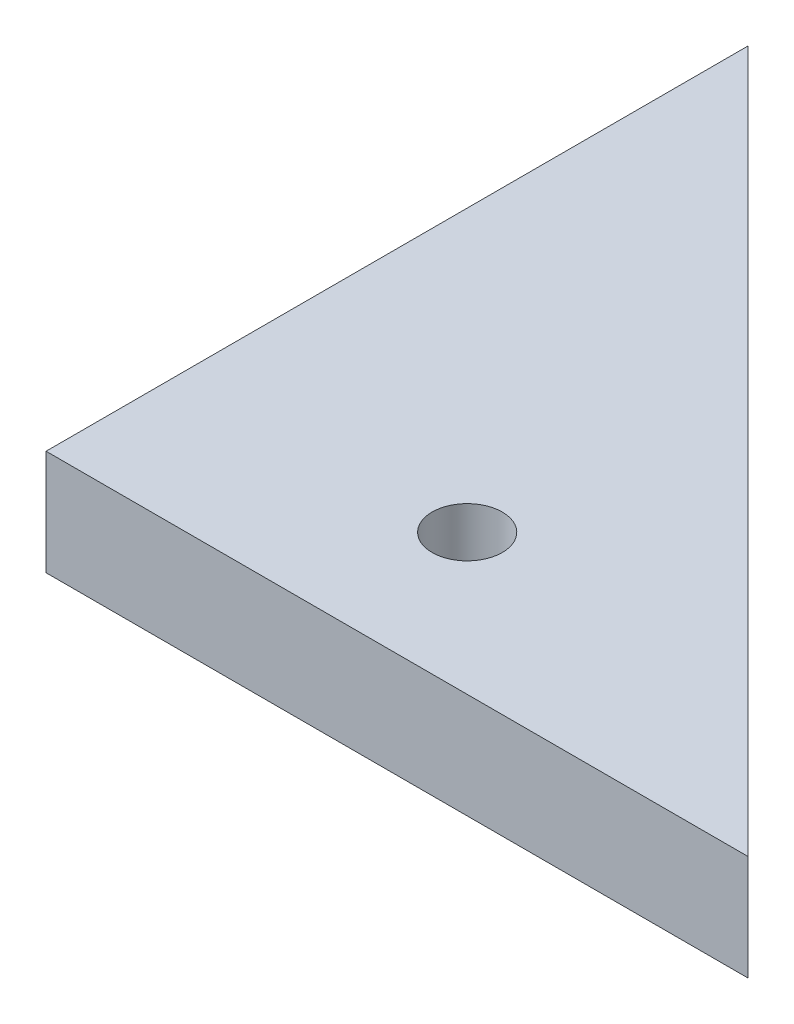
ISO-10303-21;
HEADER;
FILE_DESCRIPTION(('STEP AP214'),'2;1');
FILE_NAME('part.step','',(''),(''),'','','');
FILE_SCHEMA(('AUTOMOTIVE_DESIGN { 1 0 10303 214 1 1 1 1 }'));
ENDSEC;
DATA;
#1=APPLICATION_CONTEXT('core data for automotive mechanical design processes');
#2=APPLICATION_PROTOCOL_DEFINITION('international standard','automotive_design',2000,#1);
#3=PRODUCT_CONTEXT('',#1,'mechanical');
#4=PRODUCT('Part','Part','',(#3));
#5=PRODUCT_RELATED_PRODUCT_CATEGORY('part','',(#4));
#6=PRODUCT_DEFINITION_FORMATION('','',#4);
#7=PRODUCT_DEFINITION_CONTEXT('part definition',#1,'design');
#8=PRODUCT_DEFINITION('design','',#6,#7);
#9=PRODUCT_DEFINITION_SHAPE('','',#8);
#10=(LENGTH_UNIT() NAMED_UNIT(*) SI_UNIT(.MILLI.,.METRE.));
#11=(NAMED_UNIT(*) PLANE_ANGLE_UNIT() SI_UNIT($,.RADIAN.));
#12=(NAMED_UNIT(*) SI_UNIT($,.STERADIAN.) SOLID_ANGLE_UNIT());
#13=UNCERTAINTY_MEASURE_WITH_UNIT(LENGTH_MEASURE(1.E-05),#10,'distance_accuracy_value','');
#14=(GEOMETRIC_REPRESENTATION_CONTEXT(3) GLOBAL_UNCERTAINTY_ASSIGNED_CONTEXT((#13)) GLOBAL_UNIT_ASSIGNED_CONTEXT((#10,
#11,#12)) REPRESENTATION_CONTEXT('',''));
#15=CARTESIAN_POINT('',(0.,0.,0.));
#16=DIRECTION('',(0.,0.,1.));
#17=DIRECTION('',(1.,0.,0.));
#18=AXIS2_PLACEMENT_3D('',#15,#16,#17);
#19=CARTESIAN_POINT('',(0.,19.05,0.));
#20=DIRECTION('',(0.,1.,0.));
#21=DIRECTION('',(0.,0.,1.));
#22=AXIS2_PLACEMENT_3D('',#19,#20,#21);
#23=PLANE('',#22);
#24=DIRECTION('',(1.,0.,0.));
#25=VECTOR('',#24,1.);
#26=CARTESIAN_POINT('',(-14.358347107438,19.05,0.));
#27=LINE('',#26,#25);
#28=CARTESIAN_POINT('',(-14.358347107438,19.05,0.));
#29=VERTEX_POINT('',#28);
#30=CARTESIAN_POINT('',(112.641652892562,19.05,0.));
#31=VERTEX_POINT('',#30);
#32=EDGE_CURVE('E74',#29,#31,#27,.T.);
#33=ORIENTED_EDGE('',*,*,#32,.T.);
#34=DIRECTION('',(-0.707106781186548,0.,-0.707106781186548));
#35=VECTOR('',#34,1.);
#36=CARTESIAN_POINT('',(-14.358347107438,19.05,-127.));
#37=LINE('',#36,#35);
#38=CARTESIAN_POINT('',(-14.358347107438,19.05,-127.));
#39=VERTEX_POINT('',#38);
#40=EDGE_CURVE('E70',#31,#39,#37,.T.);
#41=ORIENTED_EDGE('',*,*,#40,.T.);
#42=DIRECTION('',(0.,0.,1.));
#43=VECTOR('',#42,1.);
#44=CARTESIAN_POINT('',(-14.358347107438,19.05,0.));
#45=LINE('',#44,#43);
#46=EDGE_CURVE('E50',#39,#29,#45,.T.);
#47=ORIENTED_EDGE('',*,*,#46,.T.);
#48=EDGE_LOOP('',(#33,#41,#47));
#49=FACE_BOUND('',#48,.T.);
#50=CARTESIAN_POINT('',(36.441652892562,19.05,-25.4));
#51=DIRECTION('',(0.,1.,0.));
#52=DIRECTION('',(0.,0.,1.));
#53=AXIS2_PLACEMENT_3D('',#50,#51,#52);
#54=CIRCLE('',#53,6.35);
#55=CARTESIAN_POINT('',(36.441652892562,19.05,-31.75));
#56=VERTEX_POINT('',#55);
#57=EDGE_CURVE('E84',#56,#56,#54,.T.);
#58=ORIENTED_EDGE('',*,*,#57,.F.);
#59=EDGE_LOOP('',(#58));
#60=FACE_BOUND('',#59,.T.);
#61=ADVANCED_FACE('F33',(#49,#60),#23,.T.);
#62=CARTESIAN_POINT('',(0.,0.,0.));
#63=DIRECTION('',(0.,1.,0.));
#64=DIRECTION('',(0.,0.,1.));
#65=AXIS2_PLACEMENT_3D('',#62,#63,#64);
#66=PLANE('',#65);
#67=DIRECTION('',(1.,0.,0.));
#68=VECTOR('',#67,1.);
#69=CARTESIAN_POINT('',(-14.358347107438,0.,0.));
#70=LINE('',#69,#68);
#71=CARTESIAN_POINT('',(-14.358347107438,0.,0.));
#72=VERTEX_POINT('',#71);
#73=CARTESIAN_POINT('',(112.641652892562,0.,0.));
#74=VERTEX_POINT('',#73);
#75=EDGE_CURVE('E81',#72,#74,#70,.T.);
#76=ORIENTED_EDGE('',*,*,#75,.F.);
#77=DIRECTION('',(0.,0.,1.));
#78=VECTOR('',#77,1.);
#79=CARTESIAN_POINT('',(-14.358347107438,0.,0.));
#80=LINE('',#79,#78);
#81=CARTESIAN_POINT('',(-14.358347107438,0.,-127.));
#82=VERTEX_POINT('',#81);
#83=EDGE_CURVE('E67',#82,#72,#80,.T.);
#84=ORIENTED_EDGE('',*,*,#83,.F.);
#85=DIRECTION('',(-0.707106781186548,0.,-0.707106781186548));
#86=VECTOR('',#85,1.);
#87=CARTESIAN_POINT('',(-14.358347107438,0.,-127.));
#88=LINE('',#87,#86);
#89=EDGE_CURVE('E62',#74,#82,#88,.T.);
#90=ORIENTED_EDGE('',*,*,#89,.F.);
#91=EDGE_LOOP('',(#76,#84,#90));
#92=FACE_BOUND('',#91,.T.);
#93=CARTESIAN_POINT('',(36.441652892562,0.,-25.4));
#94=DIRECTION('',(0.,1.,0.));
#95=DIRECTION('',(0.,0.,1.));
#96=AXIS2_PLACEMENT_3D('',#93,#94,#95);
#97=CIRCLE('',#96,6.35);
#98=CARTESIAN_POINT('',(36.441652892562,0.,-31.75));
#99=VERTEX_POINT('',#98);
#100=EDGE_CURVE('E88',#99,#99,#97,.T.);
#101=ORIENTED_EDGE('',*,*,#100,.T.);
#102=EDGE_LOOP('',(#101));
#103=FACE_BOUND('',#102,.T.);
#104=ADVANCED_FACE('F94',(#92,#103),#66,.F.);
#105=CARTESIAN_POINT('',(-14.358347107438,19.05,0.));
#106=DIRECTION('',(0.,0.,-1.));
#107=DIRECTION('',(-1.,0.,0.));
#108=AXIS2_PLACEMENT_3D('',#105,#106,#107);
#109=PLANE('',#108);
#110=ORIENTED_EDGE('',*,*,#75,.T.);
#111=DIRECTION('',(0.,-1.,0.));
#112=VECTOR('',#111,1.);
#113=CARTESIAN_POINT('',(112.641652892562,19.05,0.));
#114=LINE('',#113,#112);
#115=EDGE_CURVE('E11',#31,#74,#114,.T.);
#116=ORIENTED_EDGE('',*,*,#115,.F.);
#117=ORIENTED_EDGE('',*,*,#32,.F.);
#118=DIRECTION('',(0.,-1.,0.));
#119=VECTOR('',#118,1.);
#120=CARTESIAN_POINT('',(-14.358347107438,19.05,0.));
#121=LINE('',#120,#119);
#122=EDGE_CURVE('E82',#29,#72,#121,.T.);
#123=ORIENTED_EDGE('',*,*,#122,.T.);
#124=EDGE_LOOP('',(#110,#116,#117,#123));
#125=FACE_BOUND('',#124,.T.);
#126=ADVANCED_FACE('F35',(#125),#109,.F.);
#127=CARTESIAN_POINT('',(-14.358347107438,19.05,-127.));
#128=DIRECTION('',(-0.707106781186548,0.,0.707106781186548));
#129=DIRECTION('',(0.707106781186548,0.,0.707106781186548));
#130=AXIS2_PLACEMENT_3D('',#127,#128,#129);
#131=PLANE('',#130);
#132=ORIENTED_EDGE('',*,*,#89,.T.);
#133=DIRECTION('',(0.,-1.,0.));
#134=VECTOR('',#133,1.);
#135=CARTESIAN_POINT('',(-14.358347107438,19.05,-127.));
#136=LINE('',#135,#134);
#137=EDGE_CURVE('E42',#39,#82,#136,.T.);
#138=ORIENTED_EDGE('',*,*,#137,.F.);
#139=ORIENTED_EDGE('',*,*,#40,.F.);
#140=ORIENTED_EDGE('',*,*,#115,.T.);
#141=EDGE_LOOP('',(#132,#138,#139,#140));
#142=FACE_BOUND('',#141,.T.);
#143=ADVANCED_FACE('F71',(#142),#131,.F.);
#144=CARTESIAN_POINT('',(-14.358347107438,19.05,0.));
#145=DIRECTION('',(1.,0.,0.));
#146=DIRECTION('',(0.,0.,-1.));
#147=AXIS2_PLACEMENT_3D('',#144,#145,#146);
#148=PLANE('',#147);
#149=ORIENTED_EDGE('',*,*,#83,.T.);
#150=ORIENTED_EDGE('',*,*,#122,.F.);
#151=ORIENTED_EDGE('',*,*,#46,.F.);
#152=ORIENTED_EDGE('',*,*,#137,.T.);
#153=EDGE_LOOP('',(#149,#150,#151,#152));
#154=FACE_BOUND('',#153,.T.);
#155=ADVANCED_FACE('F93',(#154),#148,.F.);
#156=CARTESIAN_POINT('',(36.441652892562,19.05,-25.4));
#157=DIRECTION('',(0.,-1.,0.));
#158=DIRECTION('',(0.,0.,-1.));
#159=AXIS2_PLACEMENT_3D('',#156,#157,#158);
#160=CYLINDRICAL_SURFACE('',#159,6.35);
#161=CARTESIAN_POINT('',(36.441652892562,19.05,-31.75));
#162=CARTESIAN_POINT('',(36.441652892562,18.8515625,-31.75));
#163=CARTESIAN_POINT('',(36.441652892562,18.653125,-31.75));
#164=CARTESIAN_POINT('',(36.441652892562,18.25625,-31.75));
#165=CARTESIAN_POINT('',(36.441652892562,18.0578125,-31.75));
#166=CARTESIAN_POINT('',(36.441652892562,17.6609375,-31.75));
#167=CARTESIAN_POINT('',(36.441652892562,17.4625,-31.75));
#168=CARTESIAN_POINT('',(36.441652892562,17.065625,-31.75));
#169=CARTESIAN_POINT('',(36.441652892562,16.8671875,-31.75));
#170=CARTESIAN_POINT('',(36.441652892562,16.4703125,-31.75));
#171=CARTESIAN_POINT('',(36.441652892562,16.271875,-31.75));
#172=CARTESIAN_POINT('',(36.441652892562,15.875,-31.75));
#173=CARTESIAN_POINT('',(36.441652892562,15.6765625,-31.75));
#174=CARTESIAN_POINT('',(36.441652892562,15.2796875,-31.75));
#175=CARTESIAN_POINT('',(36.441652892562,15.08125,-31.75));
#176=CARTESIAN_POINT('',(36.441652892562,14.684375,-31.75));
#177=CARTESIAN_POINT('',(36.441652892562,14.4859375,-31.75));
#178=CARTESIAN_POINT('',(36.441652892562,14.0890625,-31.75));
#179=CARTESIAN_POINT('',(36.441652892562,13.890625,-31.75));
#180=CARTESIAN_POINT('',(36.441652892562,13.49375,-31.75));
#181=CARTESIAN_POINT('',(36.441652892562,13.2953125,-31.75));
#182=CARTESIAN_POINT('',(36.441652892562,12.8984375,-31.75));
#183=CARTESIAN_POINT('',(36.441652892562,12.7,-31.75));
#184=CARTESIAN_POINT('',(36.441652892562,12.303125,-31.75));
#185=CARTESIAN_POINT('',(36.441652892562,12.1046875,-31.75));
#186=CARTESIAN_POINT('',(36.441652892562,11.7078125,-31.75));
#187=CARTESIAN_POINT('',(36.441652892562,11.509375,-31.75));
#188=CARTESIAN_POINT('',(36.441652892562,11.1125,-31.75));
#189=CARTESIAN_POINT('',(36.441652892562,10.9140625,-31.75));
#190=CARTESIAN_POINT('',(36.441652892562,10.5171875,-31.75));
#191=CARTESIAN_POINT('',(36.441652892562,10.31875,-31.75));
#192=CARTESIAN_POINT('',(36.441652892562,9.921875,-31.75));
#193=CARTESIAN_POINT('',(36.441652892562,9.7234375,-31.75));
#194=CARTESIAN_POINT('',(36.441652892562,9.3265625,-31.75));
#195=CARTESIAN_POINT('',(36.441652892562,9.128125,-31.75));
#196=CARTESIAN_POINT('',(36.441652892562,8.73125,-31.75));
#197=CARTESIAN_POINT('',(36.441652892562,8.5328125,-31.75));
#198=CARTESIAN_POINT('',(36.441652892562,8.1359375,-31.75));
#199=CARTESIAN_POINT('',(36.441652892562,7.9375,-31.75));
#200=CARTESIAN_POINT('',(36.441652892562,7.540625,-31.75));
#201=CARTESIAN_POINT('',(36.441652892562,7.3421875,-31.75));
#202=CARTESIAN_POINT('',(36.441652892562,6.9453125,-31.75));
#203=CARTESIAN_POINT('',(36.441652892562,6.746875,-31.75));
#204=CARTESIAN_POINT('',(36.441652892562,6.35,-31.75));
#205=CARTESIAN_POINT('',(36.441652892562,6.1515625,-31.75));
#206=CARTESIAN_POINT('',(36.441652892562,5.7546875,-31.75));
#207=CARTESIAN_POINT('',(36.441652892562,5.55625,-31.75));
#208=CARTESIAN_POINT('',(36.441652892562,5.159375,-31.75));
#209=CARTESIAN_POINT('',(36.441652892562,4.9609375,-31.75));
#210=CARTESIAN_POINT('',(36.441652892562,4.5640625,-31.75));
#211=CARTESIAN_POINT('',(36.441652892562,4.365625,-31.75));
#212=CARTESIAN_POINT('',(36.441652892562,3.96875,-31.75));
#213=CARTESIAN_POINT('',(36.441652892562,3.7703125,-31.75));
#214=CARTESIAN_POINT('',(36.441652892562,3.3734375,-31.75));
#215=CARTESIAN_POINT('',(36.441652892562,3.175,-31.75));
#216=CARTESIAN_POINT('',(36.441652892562,2.778125,-31.75));
#217=CARTESIAN_POINT('',(36.441652892562,2.5796875,-31.75));
#218=CARTESIAN_POINT('',(36.441652892562,2.1828125,-31.75));
#219=CARTESIAN_POINT('',(36.441652892562,1.984375,-31.75));
#220=CARTESIAN_POINT('',(36.441652892562,1.5875,-31.75));
#221=CARTESIAN_POINT('',(36.441652892562,1.3890625,-31.75));
#222=CARTESIAN_POINT('',(36.441652892562,0.992187500000001,-31.75));
#223=CARTESIAN_POINT('',(36.441652892562,0.793750000000001,-31.75));
#224=CARTESIAN_POINT('',(36.441652892562,0.396875,-31.75));
#225=CARTESIAN_POINT('',(36.441652892562,0.1984375,-31.75));
#226=CARTESIAN_POINT('',(36.441652892562,0.,-31.75));
#227=B_SPLINE_CURVE_WITH_KNOTS('',3,(#161,#162,#163,#164,#165,#166,#167,#168,#169,#170,#171,
#172,#173,#174,#175,#176,#177,#178,#179,#180,#181,#182,#183,#184,#185,#186,#187,#188,#189,#190,
#191,#192,#193,#194,#195,#196,#197,#198,#199,#200,#201,#202,#203,#204,#205,#206,#207,#208,#209,
#210,#211,#212,#213,#214,#215,#216,#217,#218,#219,#220,#221,#222,#223,#224,#225,#226),
.UNSPECIFIED.,.F.,.F.,(4,2,2,2,2,2,2,2,2,2,2,2,2,2,2,2,2,2,2,2,2,2,2,2,2,2,2,2,2,2,2,2,4),(0.,
0.5953125,1.190625,1.7859375,2.38125,2.9765625,3.571875,4.1671875,4.7625,5.3578125,5.953125,
6.5484375,7.14375,7.7390625,8.334375,8.9296875,9.525,10.1203125,10.715625,11.3109375,11.90625,
12.5015625,13.096875,13.6921875,14.2875,14.8828125,15.478125,16.0734375,16.66875,17.2640625,
17.859375,18.4546875,19.05),.UNSPECIFIED.);
#228=EDGE_CURVE('BSEAM102',#56,#99,#227,.T.);
#229=ORIENTED_EDGE('',*,*,#57,.T.);
#230=ORIENTED_EDGE('',*,*,#100,.F.);
#231=ORIENTED_EDGE('',*,*,#228,.T.);
#232=ORIENTED_EDGE('',*,*,#228,.F.);
#233=EDGE_LOOP('',(#229,#231,#230,#232));
#234=FACE_BOUND('',#233,.T.);
#235=ADVANCED_FACE('F102',(#234),#160,.F.);
#236=CLOSED_SHELL('',(#61,#104,#126,#143,#155,#235));
#237=MANIFOLD_SOLID_BREP('B2',#236);
#238=ADVANCED_BREP_SHAPE_REPRESENTATION('',(#18,#237),#14);
#239=SHAPE_DEFINITION_REPRESENTATION(#9,#238);
ENDSEC;
END-ISO-10303-21;
